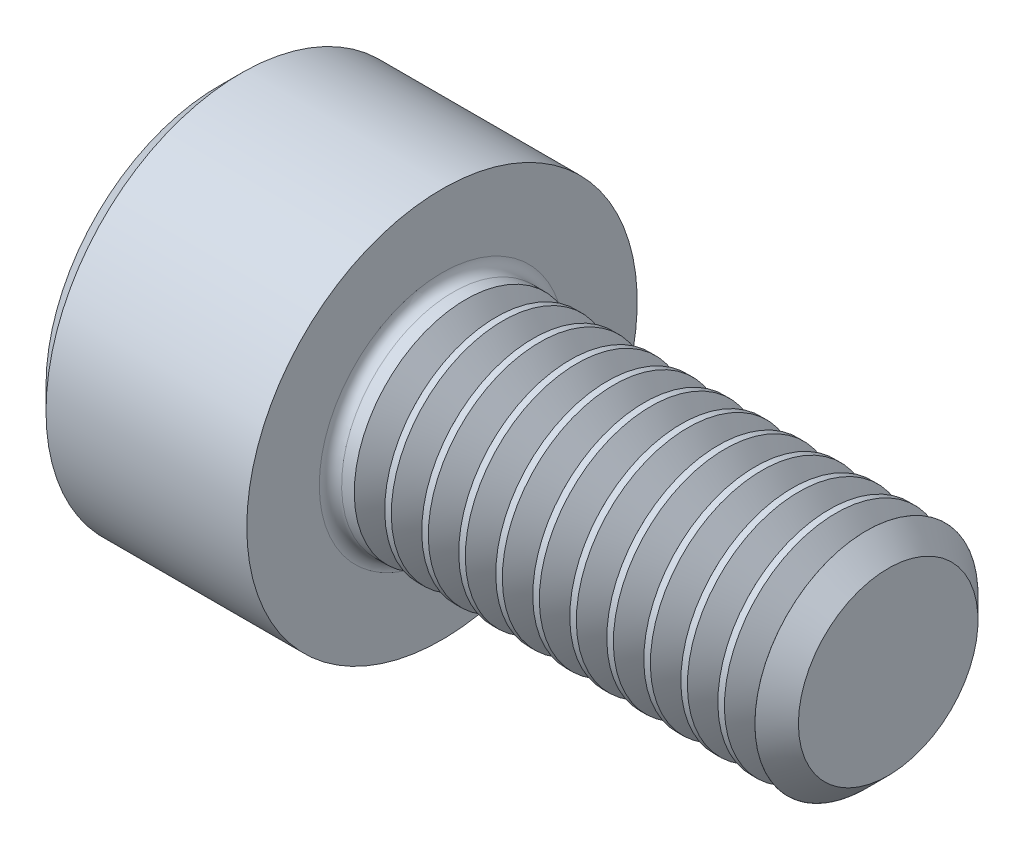
ISO-10303-21;
HEADER;
FILE_DESCRIPTION(('STEP AP214'),'2;1');
FILE_NAME('part.step','',(''),(''),'','','');
FILE_SCHEMA(('AUTOMOTIVE_DESIGN { 1 0 10303 214 1 1 1 1 }'));
ENDSEC;
DATA;
#1=APPLICATION_CONTEXT('core data for automotive mechanical design processes');
#2=APPLICATION_PROTOCOL_DEFINITION('international standard','automotive_design',2000,#1);
#3=PRODUCT_CONTEXT('',#1,'mechanical');
#4=PRODUCT('Part','Part','',(#3));
#5=PRODUCT_RELATED_PRODUCT_CATEGORY('part','',(#4));
#6=PRODUCT_DEFINITION_FORMATION('','',#4);
#7=PRODUCT_DEFINITION_CONTEXT('part definition',#1,'design');
#8=PRODUCT_DEFINITION('design','',#6,#7);
#9=PRODUCT_DEFINITION_SHAPE('','',#8);
#10=(LENGTH_UNIT() NAMED_UNIT(*) SI_UNIT(.MILLI.,.METRE.));
#11=(NAMED_UNIT(*) PLANE_ANGLE_UNIT() SI_UNIT($,.RADIAN.));
#12=(NAMED_UNIT(*) SI_UNIT($,.STERADIAN.) SOLID_ANGLE_UNIT());
#13=UNCERTAINTY_MEASURE_WITH_UNIT(LENGTH_MEASURE(1.E-05),#10,'distance_accuracy_value','');
#14=(GEOMETRIC_REPRESENTATION_CONTEXT(3) GLOBAL_UNCERTAINTY_ASSIGNED_CONTEXT((#13)) GLOBAL_UNIT_ASSIGNED_CONTEXT((#10,
#11,#12)) REPRESENTATION_CONTEXT('',''));
#15=CARTESIAN_POINT('',(0.,0.,0.));
#16=DIRECTION('',(0.,0.,1.));
#17=DIRECTION('',(1.,0.,0.));
#18=AXIS2_PLACEMENT_3D('',#15,#16,#17);
#19=CARTESIAN_POINT('',(0.,0.,0.));
#20=DIRECTION('',(-1.,0.,0.));
#21=DIRECTION('',(0.,0.,1.));
#22=AXIS2_PLACEMENT_3D('',#19,#20,#21);
#23=PLANE('',#22);
#24=DIRECTION('',(0.,-0.499999999999999,0.866025403784439));
#25=VECTOR('',#24,1.);
#26=CARTESIAN_POINT('',(0.,1.77304267668134,0.));
#27=LINE('',#26,#25);
#28=CARTESIAN_POINT('',(0.,1.77304267668134,0.));
#29=VERTEX_POINT('',#28);
#30=CARTESIAN_POINT('',(0.,0.886521338340669,1.5355));
#31=VERTEX_POINT('',#30);
#32=EDGE_CURVE('E426',#29,#31,#27,.T.);
#33=ORIENTED_EDGE('',*,*,#32,.T.);
#34=DIRECTION('',(0.,1.,0.));
#35=VECTOR('',#34,1.);
#36=CARTESIAN_POINT('',(0.,-0.886521338340672,1.5355));
#37=LINE('',#36,#35);
#38=CARTESIAN_POINT('',(0.,-0.886521338340672,1.5355));
#39=VERTEX_POINT('',#38);
#40=EDGE_CURVE('E130',#39,#31,#37,.T.);
#41=ORIENTED_EDGE('',*,*,#40,.F.);
#42=DIRECTION('',(0.,-0.500000000000001,-0.866025403784438));
#43=VECTOR('',#42,1.);
#44=CARTESIAN_POINT('',(0.,-0.886521338340672,1.5355));
#45=LINE('',#44,#43);
#46=CARTESIAN_POINT('',(0.,-1.77304267668134,0.));
#47=VERTEX_POINT('',#46);
#48=EDGE_CURVE('E445',#39,#47,#45,.T.);
#49=ORIENTED_EDGE('',*,*,#48,.T.);
#50=DIRECTION('',(0.,0.499999999999999,-0.866025403784439));
#51=VECTOR('',#50,1.);
#52=CARTESIAN_POINT('',(0.,-1.77304267668134,0.));
#53=LINE('',#52,#51);
#54=CARTESIAN_POINT('',(0.,-0.886521338340676,-1.5355));
#55=VERTEX_POINT('',#54);
#56=EDGE_CURVE('E448',#47,#55,#53,.T.);
#57=ORIENTED_EDGE('',*,*,#56,.T.);
#58=DIRECTION('',(0.,-1.,0.));
#59=VECTOR('',#58,1.);
#60=CARTESIAN_POINT('',(0.,0.886521338340665,-1.5355));
#61=LINE('',#60,#59);
#62=CARTESIAN_POINT('',(0.,0.886521338340665,-1.5355));
#63=VERTEX_POINT('',#62);
#64=EDGE_CURVE('E451',#63,#55,#61,.T.);
#65=ORIENTED_EDGE('',*,*,#64,.F.);
#66=DIRECTION('',(0.,-0.500000000000001,-0.866025403784438));
#67=VECTOR('',#66,1.);
#68=CARTESIAN_POINT('',(0.,1.77304267668134,0.));
#69=LINE('',#68,#67);
#70=EDGE_CURVE('E125',#29,#63,#69,.T.);
#71=ORIENTED_EDGE('',*,*,#70,.F.);
#72=EDGE_LOOP('',(#33,#41,#49,#57,#65,#71));
#73=FACE_BOUND('',#72,.T.);
#74=CARTESIAN_POINT('',(0.,0.,0.));
#75=DIRECTION('',(-1.,0.,0.));
#76=DIRECTION('',(0.,0.,1.));
#77=AXIS2_PLACEMENT_3D('',#74,#75,#76);
#78=CIRCLE('',#77,3.1);
#79=CARTESIAN_POINT('',(0.,0.,3.1));
#80=VERTEX_POINT('',#79);
#81=EDGE_CURVE('E154',#80,#80,#78,.T.);
#82=ORIENTED_EDGE('',*,*,#81,.T.);
#83=EDGE_LOOP('',(#82));
#84=FACE_BOUND('',#83,.T.);
#85=ADVANCED_FACE('F34',(#73,#84),#23,.T.);
#86=CARTESIAN_POINT('',(0.,0.,0.));
#87=DIRECTION('',(1.,0.,0.));
#88=DIRECTION('',(0.,0.,-1.));
#89=AXIS2_PLACEMENT_3D('',#86,#87,#88);
#90=CONICAL_SURFACE('',#89,3.1,0.785398163397451);
#91=CARTESIAN_POINT('',(0.399999999999998,0.,0.));
#92=DIRECTION('',(-1.,0.,0.));
#93=DIRECTION('',(0.,0.,1.));
#94=AXIS2_PLACEMENT_3D('',#91,#92,#93);
#95=CIRCLE('',#94,3.5);
#96=CARTESIAN_POINT('',(0.399999999999998,0.,3.5));
#97=VERTEX_POINT('',#96);
#98=EDGE_CURVE('E151',#97,#97,#95,.T.);
#99=ORIENTED_EDGE('',*,*,#98,.T.);
#100=EDGE_LOOP('',(#99));
#101=FACE_BOUND('',#100,.T.);
#102=ORIENTED_EDGE('',*,*,#81,.F.);
#103=EDGE_LOOP('',(#102));
#104=FACE_BOUND('',#103,.T.);
#105=ADVANCED_FACE('F176',(#101,#104),#90,.T.);
#106=CARTESIAN_POINT('',(-31.75,0.,0.));
#107=DIRECTION('',(-1.,0.,0.));
#108=DIRECTION('',(0.,0.,1.));
#109=AXIS2_PLACEMENT_3D('',#106,#107,#108);
#110=CYLINDRICAL_SURFACE('',#109,3.5);
#111=CARTESIAN_POINT('',(4.,0.,0.));
#112=DIRECTION('',(-1.,0.,0.));
#113=DIRECTION('',(0.,0.,1.));
#114=AXIS2_PLACEMENT_3D('',#111,#112,#113);
#115=CIRCLE('',#114,3.5);
#116=CARTESIAN_POINT('',(4.,0.,3.5));
#117=VERTEX_POINT('',#116);
#118=EDGE_CURVE('E148',#117,#117,#115,.T.);
#119=ORIENTED_EDGE('',*,*,#118,.T.);
#120=EDGE_LOOP('',(#119));
#121=FACE_BOUND('',#120,.T.);
#122=ORIENTED_EDGE('',*,*,#98,.F.);
#123=EDGE_LOOP('',(#122));
#124=FACE_BOUND('',#123,.T.);
#125=ADVANCED_FACE('F181',(#121,#124),#110,.T.);
#126=CARTESIAN_POINT('',(4.,3.5,0.));
#127=DIRECTION('',(1.,0.,0.));
#128=DIRECTION('',(0.,0.,-1.));
#129=AXIS2_PLACEMENT_3D('',#126,#127,#128);
#130=PLANE('',#129);
#131=CARTESIAN_POINT('',(4.,0.,0.));
#132=DIRECTION('',(1.,0.,0.));
#133=DIRECTION('',(0.,0.,-1.));
#134=AXIS2_PLACEMENT_3D('',#131,#132,#133);
#135=CIRCLE('',#134,2.19999999999981);
#136=CARTESIAN_POINT('',(4.,0.,-2.19999999999981));
#137=VERTEX_POINT('',#136);
#138=EDGE_CURVE('E42',#137,#137,#135,.F.);
#139=ORIENTED_EDGE('',*,*,#138,.T.);
#140=EDGE_LOOP('',(#139));
#141=FACE_BOUND('',#140,.T.);
#142=ORIENTED_EDGE('',*,*,#118,.F.);
#143=EDGE_LOOP('',(#142));
#144=FACE_BOUND('',#143,.T.);
#145=ADVANCED_FACE('F159',(#141,#144),#130,.T.);
#146=CARTESIAN_POINT('',(-31.75,0.,0.));
#147=DIRECTION('',(-1.,0.,0.));
#148=DIRECTION('',(0.,0.,1.));
#149=AXIS2_PLACEMENT_3D('',#146,#147,#148);
#150=CYLINDRICAL_SURFACE('',#149,1.99999999999981);
#151=CARTESIAN_POINT('',(4.42691906009821,0.,0.));
#152=DIRECTION('',(-1.,0.,0.));
#153=DIRECTION('',(0.,-1.,0.));
#154=AXIS2_PLACEMENT_3D('',#151,#152,#153);
#155=CIRCLE('',#154,2.);
#156=CARTESIAN_POINT('',(4.42691906009821,-2.,0.));
#157=VERTEX_POINT('',#156);
#158=EDGE_CURVE('E421',#157,#157,#155,.T.);
#159=ORIENTED_EDGE('',*,*,#158,.T.);
#160=EDGE_LOOP('',(#159));
#161=FACE_BOUND('',#160,.T.);
#162=CARTESIAN_POINT('',(4.2,0.,0.));
#163=DIRECTION('',(1.,0.,0.));
#164=DIRECTION('',(0.,0.,-1.));
#165=AXIS2_PLACEMENT_3D('',#162,#163,#164);
#166=CIRCLE('',#165,1.99999999999981);
#167=CARTESIAN_POINT('',(4.2,0.,-1.99999999999981));
#168=VERTEX_POINT('',#167);
#169=EDGE_CURVE('E11',#168,#168,#166,.T.);
#170=ORIENTED_EDGE('',*,*,#169,.T.);
#171=EDGE_LOOP('',(#170));
#172=FACE_BOUND('',#171,.T.);
#173=ADVANCED_FACE('F163',(#161,#172),#150,.T.);
#174=CARTESIAN_POINT('',(4.2,0.,0.));
#175=DIRECTION('',(1.,0.,0.));
#176=DIRECTION('',(0.,0.,-1.));
#177=AXIS2_PLACEMENT_3D('',#174,#175,#176);
#178=TOROIDAL_SURFACE('',#177,2.19999999999981,0.2);
#179=ORIENTED_EDGE('',*,*,#169,.F.);
#180=EDGE_LOOP('',(#179));
#181=FACE_BOUND('',#180,.T.);
#182=ORIENTED_EDGE('',*,*,#138,.F.);
#183=EDGE_LOOP('',(#182));
#184=FACE_BOUND('',#183,.T.);
#185=ADVANCED_FACE('F36',(#181,#184),#178,.F.);
#186=CARTESIAN_POINT('',(2.,1.77304267668134,0.));
#187=DIRECTION('',(0.,-0.866025403784439,-0.499999999999999));
#188=DIRECTION('',(0.,0.499999999999999,-0.866025403784439));
#189=AXIS2_PLACEMENT_3D('',#186,#187,#188);
#190=PLANE('',#189);
#191=ORIENTED_EDGE('',*,*,#32,.F.);
#192=DIRECTION('',(-1.,0.,0.));
#193=VECTOR('',#192,1.);
#194=CARTESIAN_POINT('',(2.,1.77304267668134,0.));
#195=LINE('',#194,#193);
#196=CARTESIAN_POINT('',(2.,1.77304267668134,0.));
#197=VERTEX_POINT('',#196);
#198=EDGE_CURVE('E442',#197,#29,#195,.T.);
#199=ORIENTED_EDGE('',*,*,#198,.F.);
#200=DIRECTION('',(0.,-0.499999999999999,0.866025403784439));
#201=VECTOR('',#200,1.);
#202=CARTESIAN_POINT('',(2.,1.77304267668134,0.));
#203=LINE('',#202,#201);
#204=CARTESIAN_POINT('',(2.,1.329782007511,0.767749999999996));
#205=VERTEX_POINT('',#204);
#206=EDGE_CURVE('E117',#197,#205,#203,.T.);
#207=ORIENTED_EDGE('',*,*,#206,.T.);
#208=CARTESIAN_POINT('',(2.,0.886521338340669,1.5355));
#209=VERTEX_POINT('',#208);
#210=EDGE_CURVE('E108',#205,#209,#203,.T.);
#211=ORIENTED_EDGE('',*,*,#210,.T.);
#212=DIRECTION('',(-1.,0.,0.));
#213=VECTOR('',#212,1.);
#214=CARTESIAN_POINT('',(2.,0.886521338340669,1.5355));
#215=LINE('',#214,#213);
#216=EDGE_CURVE('E122',#209,#31,#215,.T.);
#217=ORIENTED_EDGE('',*,*,#216,.T.);
#218=EDGE_LOOP('',(#191,#199,#207,#211,#217));
#219=FACE_BOUND('',#218,.T.);
#220=ADVANCED_FACE('F121',(#219),#190,.T.);
#221=CARTESIAN_POINT('',(2.,-0.886521338340672,1.5355));
#222=DIRECTION('',(0.,0.,1.));
#223=DIRECTION('',(0.,-1.,0.));
#224=AXIS2_PLACEMENT_3D('',#221,#222,#223);
#225=PLANE('',#224);
#226=ORIENTED_EDGE('',*,*,#40,.T.);
#227=ORIENTED_EDGE('',*,*,#216,.F.);
#228=DIRECTION('',(0.,1.,0.));
#229=VECTOR('',#228,1.);
#230=CARTESIAN_POINT('',(2.,-0.886521338340672,1.5355));
#231=LINE('',#230,#229);
#232=CARTESIAN_POINT('',(2.,0.,1.5355));
#233=VERTEX_POINT('',#232);
#234=EDGE_CURVE('E105',#233,#209,#231,.T.);
#235=ORIENTED_EDGE('',*,*,#234,.F.);
#236=CARTESIAN_POINT('',(2.,-0.886521338340672,1.5355));
#237=VERTEX_POINT('',#236);
#238=EDGE_CURVE('E116',#237,#233,#231,.T.);
#239=ORIENTED_EDGE('',*,*,#238,.F.);
#240=DIRECTION('',(-1.,0.,0.));
#241=VECTOR('',#240,1.);
#242=CARTESIAN_POINT('',(2.,-0.886521338340672,1.5355));
#243=LINE('',#242,#241);
#244=EDGE_CURVE('E132',#237,#39,#243,.T.);
#245=ORIENTED_EDGE('',*,*,#244,.T.);
#246=EDGE_LOOP('',(#226,#227,#235,#239,#245));
#247=FACE_BOUND('',#246,.T.);
#248=ADVANCED_FACE('F127',(#247),#225,.F.);
#249=CARTESIAN_POINT('',(2.,-0.886521338340672,1.5355));
#250=DIRECTION('',(0.,0.866025403784438,-0.500000000000001));
#251=DIRECTION('',(0.,0.500000000000001,0.866025403784438));
#252=AXIS2_PLACEMENT_3D('',#249,#250,#251);
#253=PLANE('',#252);
#254=ORIENTED_EDGE('',*,*,#48,.F.);
#255=ORIENTED_EDGE('',*,*,#244,.F.);
#256=DIRECTION('',(0.,-0.500000000000001,-0.866025403784438));
#257=VECTOR('',#256,1.);
#258=CARTESIAN_POINT('',(2.,-0.886521338340672,1.5355));
#259=LINE('',#258,#257);
#260=CARTESIAN_POINT('',(2.,-1.32978200751101,0.767750000000002));
#261=VERTEX_POINT('',#260);
#262=EDGE_CURVE('E429',#237,#261,#259,.T.);
#263=ORIENTED_EDGE('',*,*,#262,.T.);
#264=CARTESIAN_POINT('',(2.,-1.77304267668134,0.));
#265=VERTEX_POINT('',#264);
#266=EDGE_CURVE('E428',#261,#265,#259,.T.);
#267=ORIENTED_EDGE('',*,*,#266,.T.);
#268=DIRECTION('',(-1.,0.,0.));
#269=VECTOR('',#268,1.);
#270=CARTESIAN_POINT('',(2.,-1.77304267668134,0.));
#271=LINE('',#270,#269);
#272=EDGE_CURVE('E137',#265,#47,#271,.T.);
#273=ORIENTED_EDGE('',*,*,#272,.T.);
#274=EDGE_LOOP('',(#254,#255,#263,#267,#273));
#275=FACE_BOUND('',#274,.T.);
#276=ADVANCED_FACE('F207',(#275),#253,.T.);
#277=CARTESIAN_POINT('',(2.,-1.77304267668134,0.));
#278=DIRECTION('',(0.,0.866025403784439,0.499999999999999));
#279=DIRECTION('',(0.,-0.499999999999999,0.866025403784439));
#280=AXIS2_PLACEMENT_3D('',#277,#278,#279);
#281=PLANE('',#280);
#282=ORIENTED_EDGE('',*,*,#56,.F.);
#283=ORIENTED_EDGE('',*,*,#272,.F.);
#284=DIRECTION('',(0.,0.499999999999999,-0.866025403784439));
#285=VECTOR('',#284,1.);
#286=CARTESIAN_POINT('',(2.,-1.77304267668134,0.));
#287=LINE('',#286,#285);
#288=CARTESIAN_POINT('',(2.,-1.32978200751101,-0.76775));
#289=VERTEX_POINT('',#288);
#290=EDGE_CURVE('E433',#265,#289,#287,.T.);
#291=ORIENTED_EDGE('',*,*,#290,.T.);
#292=CARTESIAN_POINT('',(2.,-0.886521338340676,-1.5355));
#293=VERTEX_POINT('',#292);
#294=EDGE_CURVE('E432',#289,#293,#287,.T.);
#295=ORIENTED_EDGE('',*,*,#294,.T.);
#296=DIRECTION('',(-1.,0.,0.));
#297=VECTOR('',#296,1.);
#298=CARTESIAN_POINT('',(2.,-0.886521338340676,-1.5355));
#299=LINE('',#298,#297);
#300=EDGE_CURVE('E460',#293,#55,#299,.T.);
#301=ORIENTED_EDGE('',*,*,#300,.T.);
#302=EDGE_LOOP('',(#282,#283,#291,#295,#301));
#303=FACE_BOUND('',#302,.T.);
#304=ADVANCED_FACE('F210',(#303),#281,.T.);
#305=CARTESIAN_POINT('',(2.,0.886521338340665,-1.5355));
#306=DIRECTION('',(0.,0.,-1.));
#307=DIRECTION('',(0.,1.,0.));
#308=AXIS2_PLACEMENT_3D('',#305,#306,#307);
#309=PLANE('',#308);
#310=ORIENTED_EDGE('',*,*,#64,.T.);
#311=ORIENTED_EDGE('',*,*,#300,.F.);
#312=DIRECTION('',(0.,-1.,0.));
#313=VECTOR('',#312,1.);
#314=CARTESIAN_POINT('',(2.,0.886521338340665,-1.5355));
#315=LINE('',#314,#313);
#316=CARTESIAN_POINT('',(2.,0.,-1.5355));
#317=VERTEX_POINT('',#316);
#318=EDGE_CURVE('E436',#317,#293,#315,.T.);
#319=ORIENTED_EDGE('',*,*,#318,.F.);
#320=CARTESIAN_POINT('',(2.,0.886521338340665,-1.5355));
#321=VERTEX_POINT('',#320);
#322=EDGE_CURVE('E49',#321,#317,#315,.T.);
#323=ORIENTED_EDGE('',*,*,#322,.F.);
#324=DIRECTION('',(-1.,0.,0.));
#325=VECTOR('',#324,1.);
#326=CARTESIAN_POINT('',(2.,0.886521338340665,-1.5355));
#327=LINE('',#326,#325);
#328=EDGE_CURVE('E457',#321,#63,#327,.T.);
#329=ORIENTED_EDGE('',*,*,#328,.T.);
#330=EDGE_LOOP('',(#310,#311,#319,#323,#329));
#331=FACE_BOUND('',#330,.T.);
#332=ADVANCED_FACE('F214',(#331),#309,.F.);
#333=CARTESIAN_POINT('',(2.,1.77304267668134,0.));
#334=DIRECTION('',(0.,0.866025403784438,-0.500000000000001));
#335=DIRECTION('',(0.,0.500000000000001,0.866025403784438));
#336=AXIS2_PLACEMENT_3D('',#333,#334,#335);
#337=PLANE('',#336);
#338=ORIENTED_EDGE('',*,*,#70,.T.);
#339=ORIENTED_EDGE('',*,*,#328,.F.);
#340=DIRECTION('',(0.,-0.500000000000001,-0.866025403784438));
#341=VECTOR('',#340,1.);
#342=CARTESIAN_POINT('',(2.,1.77304267668134,0.));
#343=LINE('',#342,#341);
#344=CARTESIAN_POINT('',(2.,1.329782007511,-0.767750000000001));
#345=VERTEX_POINT('',#344);
#346=EDGE_CURVE('E438',#345,#321,#343,.T.);
#347=ORIENTED_EDGE('',*,*,#346,.F.);
#348=EDGE_CURVE('E439',#197,#345,#343,.T.);
#349=ORIENTED_EDGE('',*,*,#348,.F.);
#350=ORIENTED_EDGE('',*,*,#198,.T.);
#351=EDGE_LOOP('',(#338,#339,#347,#349,#350));
#352=FACE_BOUND('',#351,.T.);
#353=ADVANCED_FACE('F218',(#352),#337,.F.);
#354=CARTESIAN_POINT('',(2.,2.65956401502201,-1.53550000000001));
#355=DIRECTION('',(1.,0.,0.));
#356=DIRECTION('',(0.,0.,-1.));
#357=AXIS2_PLACEMENT_3D('',#354,#355,#356);
#358=PLANE('',#357);
#359=ORIENTED_EDGE('',*,*,#318,.T.);
#360=ORIENTED_EDGE('',*,*,#294,.F.);
#361=CARTESIAN_POINT('',(2.,0.,0.));
#362=DIRECTION('',(-1.,0.,0.));
#363=DIRECTION('',(0.,0.,1.));
#364=AXIS2_PLACEMENT_3D('',#361,#362,#363);
#365=CIRCLE('',#364,1.5355);
#366=EDGE_CURVE('E477',#317,#289,#365,.T.);
#367=ORIENTED_EDGE('',*,*,#366,.F.);
#368=EDGE_LOOP('',(#359,#360,#367));
#369=FACE_BOUND('',#368,.T.);
#370=ADVANCED_FACE('F222',(#369),#358,.F.);
#371=ORIENTED_EDGE('',*,*,#290,.F.);
#372=ORIENTED_EDGE('',*,*,#266,.F.);
#373=EDGE_CURVE('E135',#289,#261,#365,.T.);
#374=ORIENTED_EDGE('',*,*,#373,.F.);
#375=EDGE_LOOP('',(#371,#372,#374));
#376=FACE_BOUND('',#375,.T.);
#377=ADVANCED_FACE('F226',(#376),#358,.F.);
#378=ORIENTED_EDGE('',*,*,#262,.F.);
#379=ORIENTED_EDGE('',*,*,#238,.T.);
#380=EDGE_CURVE('E131',#261,#233,#365,.T.);
#381=ORIENTED_EDGE('',*,*,#380,.F.);
#382=EDGE_LOOP('',(#378,#379,#381));
#383=FACE_BOUND('',#382,.T.);
#384=ADVANCED_FACE('F486',(#383),#358,.F.);
#385=ORIENTED_EDGE('',*,*,#234,.T.);
#386=ORIENTED_EDGE('',*,*,#210,.F.);
#387=EDGE_CURVE('E111',#233,#205,#365,.T.);
#388=ORIENTED_EDGE('',*,*,#387,.F.);
#389=EDGE_LOOP('',(#385,#386,#388));
#390=FACE_BOUND('',#389,.T.);
#391=ADVANCED_FACE('F107',(#390),#358,.F.);
#392=ORIENTED_EDGE('',*,*,#206,.F.);
#393=ORIENTED_EDGE('',*,*,#348,.T.);
#394=EDGE_CURVE('E142',#205,#345,#365,.T.);
#395=ORIENTED_EDGE('',*,*,#394,.F.);
#396=EDGE_LOOP('',(#392,#393,#395));
#397=FACE_BOUND('',#396,.T.);
#398=ADVANCED_FACE('F472',(#397),#358,.F.);
#399=ORIENTED_EDGE('',*,*,#346,.T.);
#400=ORIENTED_EDGE('',*,*,#322,.T.);
#401=EDGE_CURVE('E476',#345,#317,#365,.T.);
#402=ORIENTED_EDGE('',*,*,#401,.F.);
#403=EDGE_LOOP('',(#399,#400,#402));
#404=FACE_BOUND('',#403,.T.);
#405=ADVANCED_FACE('F203',(#404),#358,.F.);
#406=CARTESIAN_POINT('',(2.,0.,0.));
#407=DIRECTION('',(-1.,0.,0.));
#408=DIRECTION('',(0.,0.,1.));
#409=AXIS2_PLACEMENT_3D('',#406,#407,#408);
#410=CONICAL_SURFACE('',#409,1.5355,1.04719755119659);
#411=CARTESIAN_POINT('',(2.88652133834068,0.,0.));
#412=VERTEX_POINT('',#411);
#413=VERTEX_LOOP('',#412);
#414=FACE_BOUND('',#413,.T.);
#415=ORIENTED_EDGE('',*,*,#387,.T.);
#416=ORIENTED_EDGE('',*,*,#394,.T.);
#417=ORIENTED_EDGE('',*,*,#401,.T.);
#418=ORIENTED_EDGE('',*,*,#366,.T.);
#419=ORIENTED_EDGE('',*,*,#373,.T.);
#420=ORIENTED_EDGE('',*,*,#380,.T.);
#421=EDGE_LOOP('',(#415,#416,#417,#418,#419,#420));
#422=FACE_BOUND('',#421,.T.);
#423=ADVANCED_FACE('F200',(#414,#422),#410,.F.);
#424=CARTESIAN_POINT('',(4.97308093990178,0.,0.));
#425=DIRECTION('',(1.,0.,0.));
#426=DIRECTION('',(0.,1.,0.));
#427=AXIS2_PLACEMENT_3D('',#424,#425,#426);
#428=CONICAL_SURFACE('',#427,2.,0.959931088596884);
#429=CARTESIAN_POINT('',(4.7,0.,0.));
#430=DIRECTION('',(-1.,0.,0.));
#431=DIRECTION('',(0.,-1.,0.));
#432=AXIS2_PLACEMENT_3D('',#429,#430,#431);
#433=CIRCLE('',#432,1.61);
#434=CARTESIAN_POINT('',(4.7,-1.61,0.));
#435=VERTEX_POINT('',#434);
#436=EDGE_CURVE('E418',#435,#435,#433,.T.);
#437=ORIENTED_EDGE('',*,*,#436,.F.);
#438=EDGE_LOOP('',(#437));
#439=FACE_BOUND('',#438,.T.);
#440=CARTESIAN_POINT('',(4.97308093990178,0.,0.));
#441=DIRECTION('',(-1.,0.,0.));
#442=DIRECTION('',(0.,-1.,0.));
#443=AXIS2_PLACEMENT_3D('',#440,#441,#442);
#444=CIRCLE('',#443,2.);
#445=CARTESIAN_POINT('',(4.97308093990178,-2.,0.));
#446=VERTEX_POINT('',#445);
#447=EDGE_CURVE('E424',#446,#446,#444,.T.);
#448=ORIENTED_EDGE('',*,*,#447,.T.);
#449=EDGE_LOOP('',(#448));
#450=FACE_BOUND('',#449,.T.);
#451=ADVANCED_FACE('F202',(#439,#450),#428,.T.);
#452=CARTESIAN_POINT('',(4.7,0.,0.));
#453=DIRECTION('',(-1.,0.,0.));
#454=DIRECTION('',(0.,-1.,0.));
#455=AXIS2_PLACEMENT_3D('',#452,#453,#454);
#456=CONICAL_SURFACE('',#455,1.61,0.959931088596875);
#457=ORIENTED_EDGE('',*,*,#158,.F.);
#458=EDGE_LOOP('',(#457));
#459=FACE_BOUND('',#458,.T.);
#460=ORIENTED_EDGE('',*,*,#436,.T.);
#461=EDGE_LOOP('',(#460));
#462=FACE_BOUND('',#461,.T.);
#463=ADVANCED_FACE('F230',(#459,#462),#456,.T.);
#464=CARTESIAN_POINT('',(5.09055542373457,0.,0.));
#465=DIRECTION('',(-1.,0.,0.));
#466=DIRECTION('',(0.,-1.,0.));
#467=AXIS2_PLACEMENT_3D('',#464,#465,#466);
#468=CIRCLE('',#467,2.);
#469=CARTESIAN_POINT('',(5.09055542373457,-2.,0.));
#470=VERTEX_POINT('',#469);
#471=EDGE_CURVE('E412',#470,#470,#468,.T.);
#472=ORIENTED_EDGE('',*,*,#471,.T.);
#473=EDGE_LOOP('',(#472));
#474=FACE_BOUND('',#473,.T.);
#475=ORIENTED_EDGE('',*,*,#447,.F.);
#476=EDGE_LOOP('',(#475));
#477=FACE_BOUND('',#476,.T.);
#478=ADVANCED_FACE('F173',(#474,#477),#150,.T.);
#479=CARTESIAN_POINT('',(5.63671730353815,0.,0.));
#480=DIRECTION('',(1.,0.,0.));
#481=DIRECTION('',(0.,1.,0.));
#482=AXIS2_PLACEMENT_3D('',#479,#480,#481);
#483=CONICAL_SURFACE('',#482,2.,0.959931088596884);
#484=CARTESIAN_POINT('',(5.36363636363636,0.,0.));
#485=DIRECTION('',(-1.,0.,0.));
#486=DIRECTION('',(0.,-1.,0.));
#487=AXIS2_PLACEMENT_3D('',#484,#485,#486);
#488=CIRCLE('',#487,1.61);
#489=CARTESIAN_POINT('',(5.36363636363636,-1.61,0.));
#490=VERTEX_POINT('',#489);
#491=EDGE_CURVE('E409',#490,#490,#488,.T.);
#492=ORIENTED_EDGE('',*,*,#491,.F.);
#493=EDGE_LOOP('',(#492));
#494=FACE_BOUND('',#493,.T.);
#495=CARTESIAN_POINT('',(5.63671730353815,0.,0.));
#496=DIRECTION('',(-1.,0.,0.));
#497=DIRECTION('',(0.,-1.,0.));
#498=AXIS2_PLACEMENT_3D('',#495,#496,#497);
#499=CIRCLE('',#498,2.);
#500=CARTESIAN_POINT('',(5.63671730353815,-2.,0.));
#501=VERTEX_POINT('',#500);
#502=EDGE_CURVE('E415',#501,#501,#499,.T.);
#503=ORIENTED_EDGE('',*,*,#502,.T.);
#504=EDGE_LOOP('',(#503));
#505=FACE_BOUND('',#504,.T.);
#506=ADVANCED_FACE('F235',(#494,#505),#483,.T.);
#507=CARTESIAN_POINT('',(5.36363636363636,0.,0.));
#508=DIRECTION('',(-1.,0.,0.));
#509=DIRECTION('',(0.,-1.,0.));
#510=AXIS2_PLACEMENT_3D('',#507,#508,#509);
#511=CONICAL_SURFACE('',#510,1.61,0.959931088596875);
#512=ORIENTED_EDGE('',*,*,#471,.F.);
#513=EDGE_LOOP('',(#512));
#514=FACE_BOUND('',#513,.T.);
#515=ORIENTED_EDGE('',*,*,#491,.T.);
#516=EDGE_LOOP('',(#515));
#517=FACE_BOUND('',#516,.T.);
#518=ADVANCED_FACE('F238',(#514,#517),#511,.T.);
#519=CARTESIAN_POINT('',(5.75419178737094,0.,0.));
#520=DIRECTION('',(-1.,0.,0.));
#521=DIRECTION('',(0.,-1.,0.));
#522=AXIS2_PLACEMENT_3D('',#519,#520,#521);
#523=CIRCLE('',#522,2.);
#524=CARTESIAN_POINT('',(5.75419178737094,-2.,0.));
#525=VERTEX_POINT('',#524);
#526=EDGE_CURVE('E403',#525,#525,#523,.T.);
#527=ORIENTED_EDGE('',*,*,#526,.T.);
#528=EDGE_LOOP('',(#527));
#529=FACE_BOUND('',#528,.T.);
#530=ORIENTED_EDGE('',*,*,#502,.F.);
#531=EDGE_LOOP('',(#530));
#532=FACE_BOUND('',#531,.T.);
#533=ADVANCED_FACE('F242',(#529,#532),#150,.T.);
#534=CARTESIAN_POINT('',(6.30035366717451,0.,0.));
#535=DIRECTION('',(1.,0.,0.));
#536=DIRECTION('',(0.,1.,0.));
#537=AXIS2_PLACEMENT_3D('',#534,#535,#536);
#538=CONICAL_SURFACE('',#537,2.,0.959931088596884);
#539=CARTESIAN_POINT('',(6.02727272727273,0.,0.));
#540=DIRECTION('',(-1.,0.,0.));
#541=DIRECTION('',(0.,-1.,0.));
#542=AXIS2_PLACEMENT_3D('',#539,#540,#541);
#543=CIRCLE('',#542,1.61);
#544=CARTESIAN_POINT('',(6.02727272727273,-1.61,0.));
#545=VERTEX_POINT('',#544);
#546=EDGE_CURVE('E400',#545,#545,#543,.T.);
#547=ORIENTED_EDGE('',*,*,#546,.F.);
#548=EDGE_LOOP('',(#547));
#549=FACE_BOUND('',#548,.T.);
#550=CARTESIAN_POINT('',(6.30035366717451,0.,0.));
#551=DIRECTION('',(-1.,0.,0.));
#552=DIRECTION('',(0.,-1.,0.));
#553=AXIS2_PLACEMENT_3D('',#550,#551,#552);
#554=CIRCLE('',#553,2.);
#555=CARTESIAN_POINT('',(6.30035366717451,-2.,0.));
#556=VERTEX_POINT('',#555);
#557=EDGE_CURVE('E406',#556,#556,#554,.T.);
#558=ORIENTED_EDGE('',*,*,#557,.T.);
#559=EDGE_LOOP('',(#558));
#560=FACE_BOUND('',#559,.T.);
#561=ADVANCED_FACE('F244',(#549,#560),#538,.T.);
#562=CARTESIAN_POINT('',(6.02727272727273,0.,0.));
#563=DIRECTION('',(-1.,0.,0.));
#564=DIRECTION('',(0.,-1.,0.));
#565=AXIS2_PLACEMENT_3D('',#562,#563,#564);
#566=CONICAL_SURFACE('',#565,1.61,0.959931088596875);
#567=ORIENTED_EDGE('',*,*,#526,.F.);
#568=EDGE_LOOP('',(#567));
#569=FACE_BOUND('',#568,.T.);
#570=ORIENTED_EDGE('',*,*,#546,.T.);
#571=EDGE_LOOP('',(#570));
#572=FACE_BOUND('',#571,.T.);
#573=ADVANCED_FACE('F247',(#569,#572),#566,.T.);
#574=CARTESIAN_POINT('',(6.4178281510073,0.,0.));
#575=DIRECTION('',(-1.,0.,0.));
#576=DIRECTION('',(0.,-1.,0.));
#577=AXIS2_PLACEMENT_3D('',#574,#575,#576);
#578=CIRCLE('',#577,2.);
#579=CARTESIAN_POINT('',(6.4178281510073,-2.,0.));
#580=VERTEX_POINT('',#579);
#581=EDGE_CURVE('E394',#580,#580,#578,.T.);
#582=ORIENTED_EDGE('',*,*,#581,.T.);
#583=EDGE_LOOP('',(#582));
#584=FACE_BOUND('',#583,.T.);
#585=ORIENTED_EDGE('',*,*,#557,.F.);
#586=EDGE_LOOP('',(#585));
#587=FACE_BOUND('',#586,.T.);
#588=ADVANCED_FACE('F251',(#584,#587),#150,.T.);
#589=CARTESIAN_POINT('',(6.96399003081087,0.,0.));
#590=DIRECTION('',(1.,0.,0.));
#591=DIRECTION('',(0.,1.,0.));
#592=AXIS2_PLACEMENT_3D('',#589,#590,#591);
#593=CONICAL_SURFACE('',#592,2.,0.959931088596884);
#594=CARTESIAN_POINT('',(6.69090909090909,0.,0.));
#595=DIRECTION('',(-1.,0.,0.));
#596=DIRECTION('',(0.,-1.,0.));
#597=AXIS2_PLACEMENT_3D('',#594,#595,#596);
#598=CIRCLE('',#597,1.61);
#599=CARTESIAN_POINT('',(6.69090909090909,-1.61,0.));
#600=VERTEX_POINT('',#599);
#601=EDGE_CURVE('E391',#600,#600,#598,.T.);
#602=ORIENTED_EDGE('',*,*,#601,.F.);
#603=EDGE_LOOP('',(#602));
#604=FACE_BOUND('',#603,.T.);
#605=CARTESIAN_POINT('',(6.96399003081087,0.,0.));
#606=DIRECTION('',(-1.,0.,0.));
#607=DIRECTION('',(0.,-1.,0.));
#608=AXIS2_PLACEMENT_3D('',#605,#606,#607);
#609=CIRCLE('',#608,2.);
#610=CARTESIAN_POINT('',(6.96399003081087,-2.,0.));
#611=VERTEX_POINT('',#610);
#612=EDGE_CURVE('E397',#611,#611,#609,.T.);
#613=ORIENTED_EDGE('',*,*,#612,.T.);
#614=EDGE_LOOP('',(#613));
#615=FACE_BOUND('',#614,.T.);
#616=ADVANCED_FACE('F253',(#604,#615),#593,.T.);
#617=CARTESIAN_POINT('',(6.69090909090909,0.,0.));
#618=DIRECTION('',(-1.,0.,0.));
#619=DIRECTION('',(0.,-1.,0.));
#620=AXIS2_PLACEMENT_3D('',#617,#618,#619);
#621=CONICAL_SURFACE('',#620,1.61,0.959931088596875);
#622=ORIENTED_EDGE('',*,*,#581,.F.);
#623=EDGE_LOOP('',(#622));
#624=FACE_BOUND('',#623,.T.);
#625=ORIENTED_EDGE('',*,*,#601,.T.);
#626=EDGE_LOOP('',(#625));
#627=FACE_BOUND('',#626,.T.);
#628=ADVANCED_FACE('F256',(#624,#627),#621,.T.);
#629=CARTESIAN_POINT('',(7.08146451464366,0.,0.));
#630=DIRECTION('',(-1.,0.,0.));
#631=DIRECTION('',(0.,-1.,0.));
#632=AXIS2_PLACEMENT_3D('',#629,#630,#631);
#633=CIRCLE('',#632,2.);
#634=CARTESIAN_POINT('',(7.08146451464366,-2.,0.));
#635=VERTEX_POINT('',#634);
#636=EDGE_CURVE('E385',#635,#635,#633,.T.);
#637=ORIENTED_EDGE('',*,*,#636,.T.);
#638=EDGE_LOOP('',(#637));
#639=FACE_BOUND('',#638,.T.);
#640=ORIENTED_EDGE('',*,*,#612,.F.);
#641=EDGE_LOOP('',(#640));
#642=FACE_BOUND('',#641,.T.);
#643=ADVANCED_FACE('F260',(#639,#642),#150,.T.);
#644=CARTESIAN_POINT('',(7.62762639444724,0.,0.));
#645=DIRECTION('',(1.,0.,0.));
#646=DIRECTION('',(0.,1.,0.));
#647=AXIS2_PLACEMENT_3D('',#644,#645,#646);
#648=CONICAL_SURFACE('',#647,2.,0.959931088596884);
#649=CARTESIAN_POINT('',(7.35454545454545,0.,0.));
#650=DIRECTION('',(-1.,0.,0.));
#651=DIRECTION('',(0.,-1.,0.));
#652=AXIS2_PLACEMENT_3D('',#649,#650,#651);
#653=CIRCLE('',#652,1.61);
#654=CARTESIAN_POINT('',(7.35454545454545,-1.61,0.));
#655=VERTEX_POINT('',#654);
#656=EDGE_CURVE('E382',#655,#655,#653,.T.);
#657=ORIENTED_EDGE('',*,*,#656,.F.);
#658=EDGE_LOOP('',(#657));
#659=FACE_BOUND('',#658,.T.);
#660=CARTESIAN_POINT('',(7.62762639444724,0.,0.));
#661=DIRECTION('',(-1.,0.,0.));
#662=DIRECTION('',(0.,-1.,0.));
#663=AXIS2_PLACEMENT_3D('',#660,#661,#662);
#664=CIRCLE('',#663,2.);
#665=CARTESIAN_POINT('',(7.62762639444724,-2.,0.));
#666=VERTEX_POINT('',#665);
#667=EDGE_CURVE('E388',#666,#666,#664,.T.);
#668=ORIENTED_EDGE('',*,*,#667,.T.);
#669=EDGE_LOOP('',(#668));
#670=FACE_BOUND('',#669,.T.);
#671=ADVANCED_FACE('F262',(#659,#670),#648,.T.);
#672=CARTESIAN_POINT('',(7.35454545454545,0.,0.));
#673=DIRECTION('',(-1.,0.,0.));
#674=DIRECTION('',(0.,-1.,0.));
#675=AXIS2_PLACEMENT_3D('',#672,#673,#674);
#676=CONICAL_SURFACE('',#675,1.61,0.959931088596875);
#677=ORIENTED_EDGE('',*,*,#636,.F.);
#678=EDGE_LOOP('',(#677));
#679=FACE_BOUND('',#678,.T.);
#680=ORIENTED_EDGE('',*,*,#656,.T.);
#681=EDGE_LOOP('',(#680));
#682=FACE_BOUND('',#681,.T.);
#683=ADVANCED_FACE('F265',(#679,#682),#676,.T.);
#684=CARTESIAN_POINT('',(7.74510087828003,0.,0.));
#685=DIRECTION('',(-1.,0.,0.));
#686=DIRECTION('',(0.,-1.,0.));
#687=AXIS2_PLACEMENT_3D('',#684,#685,#686);
#688=CIRCLE('',#687,2.);
#689=CARTESIAN_POINT('',(7.74510087828003,-2.,0.));
#690=VERTEX_POINT('',#689);
#691=EDGE_CURVE('E376',#690,#690,#688,.T.);
#692=ORIENTED_EDGE('',*,*,#691,.T.);
#693=EDGE_LOOP('',(#692));
#694=FACE_BOUND('',#693,.T.);
#695=ORIENTED_EDGE('',*,*,#667,.F.);
#696=EDGE_LOOP('',(#695));
#697=FACE_BOUND('',#696,.T.);
#698=ADVANCED_FACE('F269',(#694,#697),#150,.T.);
#699=CARTESIAN_POINT('',(8.2912627580836,0.,0.));
#700=DIRECTION('',(1.,0.,0.));
#701=DIRECTION('',(0.,1.,0.));
#702=AXIS2_PLACEMENT_3D('',#699,#700,#701);
#703=CONICAL_SURFACE('',#702,2.,0.959931088596884);
#704=CARTESIAN_POINT('',(8.01818181818182,0.,0.));
#705=DIRECTION('',(-1.,0.,0.));
#706=DIRECTION('',(0.,-1.,0.));
#707=AXIS2_PLACEMENT_3D('',#704,#705,#706);
#708=CIRCLE('',#707,1.61);
#709=CARTESIAN_POINT('',(8.01818181818182,-1.61,0.));
#710=VERTEX_POINT('',#709);
#711=EDGE_CURVE('E373',#710,#710,#708,.T.);
#712=ORIENTED_EDGE('',*,*,#711,.F.);
#713=EDGE_LOOP('',(#712));
#714=FACE_BOUND('',#713,.T.);
#715=CARTESIAN_POINT('',(8.2912627580836,0.,0.));
#716=DIRECTION('',(-1.,0.,0.));
#717=DIRECTION('',(0.,-1.,0.));
#718=AXIS2_PLACEMENT_3D('',#715,#716,#717);
#719=CIRCLE('',#718,2.);
#720=CARTESIAN_POINT('',(8.2912627580836,-2.,0.));
#721=VERTEX_POINT('',#720);
#722=EDGE_CURVE('E379',#721,#721,#719,.T.);
#723=ORIENTED_EDGE('',*,*,#722,.T.);
#724=EDGE_LOOP('',(#723));
#725=FACE_BOUND('',#724,.T.);
#726=ADVANCED_FACE('F271',(#714,#725),#703,.T.);
#727=CARTESIAN_POINT('',(8.01818181818182,0.,0.));
#728=DIRECTION('',(-1.,0.,0.));
#729=DIRECTION('',(0.,-1.,0.));
#730=AXIS2_PLACEMENT_3D('',#727,#728,#729);
#731=CONICAL_SURFACE('',#730,1.61,0.959931088596875);
#732=ORIENTED_EDGE('',*,*,#691,.F.);
#733=EDGE_LOOP('',(#732));
#734=FACE_BOUND('',#733,.T.);
#735=ORIENTED_EDGE('',*,*,#711,.T.);
#736=EDGE_LOOP('',(#735));
#737=FACE_BOUND('',#736,.T.);
#738=ADVANCED_FACE('F274',(#734,#737),#731,.T.);
#739=CARTESIAN_POINT('',(8.40873724191639,0.,0.));
#740=DIRECTION('',(-1.,0.,0.));
#741=DIRECTION('',(0.,-1.,0.));
#742=AXIS2_PLACEMENT_3D('',#739,#740,#741);
#743=CIRCLE('',#742,2.);
#744=CARTESIAN_POINT('',(8.40873724191639,-2.,0.));
#745=VERTEX_POINT('',#744);
#746=EDGE_CURVE('E367',#745,#745,#743,.T.);
#747=ORIENTED_EDGE('',*,*,#746,.T.);
#748=EDGE_LOOP('',(#747));
#749=FACE_BOUND('',#748,.T.);
#750=ORIENTED_EDGE('',*,*,#722,.F.);
#751=EDGE_LOOP('',(#750));
#752=FACE_BOUND('',#751,.T.);
#753=ADVANCED_FACE('F278',(#749,#752),#150,.T.);
#754=CARTESIAN_POINT('',(8.95489912171997,0.,0.));
#755=DIRECTION('',(1.,0.,0.));
#756=DIRECTION('',(0.,1.,0.));
#757=AXIS2_PLACEMENT_3D('',#754,#755,#756);
#758=CONICAL_SURFACE('',#757,2.,0.959931088596884);
#759=CARTESIAN_POINT('',(8.68181818181818,0.,0.));
#760=DIRECTION('',(-1.,0.,0.));
#761=DIRECTION('',(0.,-1.,0.));
#762=AXIS2_PLACEMENT_3D('',#759,#760,#761);
#763=CIRCLE('',#762,1.61);
#764=CARTESIAN_POINT('',(8.68181818181818,-1.61,0.));
#765=VERTEX_POINT('',#764);
#766=EDGE_CURVE('E364',#765,#765,#763,.T.);
#767=ORIENTED_EDGE('',*,*,#766,.F.);
#768=EDGE_LOOP('',(#767));
#769=FACE_BOUND('',#768,.T.);
#770=CARTESIAN_POINT('',(8.95489912171997,0.,0.));
#771=DIRECTION('',(-1.,0.,0.));
#772=DIRECTION('',(0.,-1.,0.));
#773=AXIS2_PLACEMENT_3D('',#770,#771,#772);
#774=CIRCLE('',#773,2.);
#775=CARTESIAN_POINT('',(8.95489912171997,-2.,0.));
#776=VERTEX_POINT('',#775);
#777=EDGE_CURVE('E370',#776,#776,#774,.T.);
#778=ORIENTED_EDGE('',*,*,#777,.T.);
#779=EDGE_LOOP('',(#778));
#780=FACE_BOUND('',#779,.T.);
#781=ADVANCED_FACE('F280',(#769,#780),#758,.T.);
#782=CARTESIAN_POINT('',(8.68181818181818,0.,0.));
#783=DIRECTION('',(-1.,0.,0.));
#784=DIRECTION('',(0.,-1.,0.));
#785=AXIS2_PLACEMENT_3D('',#782,#783,#784);
#786=CONICAL_SURFACE('',#785,1.61,0.959931088596875);
#787=ORIENTED_EDGE('',*,*,#746,.F.);
#788=EDGE_LOOP('',(#787));
#789=FACE_BOUND('',#788,.T.);
#790=ORIENTED_EDGE('',*,*,#766,.T.);
#791=EDGE_LOOP('',(#790));
#792=FACE_BOUND('',#791,.T.);
#793=ADVANCED_FACE('F283',(#789,#792),#786,.T.);
#794=CARTESIAN_POINT('',(9.07237360555275,0.,0.));
#795=DIRECTION('',(-1.,0.,0.));
#796=DIRECTION('',(0.,-1.,0.));
#797=AXIS2_PLACEMENT_3D('',#794,#795,#796);
#798=CIRCLE('',#797,2.);
#799=CARTESIAN_POINT('',(9.07237360555275,-2.,0.));
#800=VERTEX_POINT('',#799);
#801=EDGE_CURVE('E358',#800,#800,#798,.T.);
#802=ORIENTED_EDGE('',*,*,#801,.T.);
#803=EDGE_LOOP('',(#802));
#804=FACE_BOUND('',#803,.T.);
#805=ORIENTED_EDGE('',*,*,#777,.F.);
#806=EDGE_LOOP('',(#805));
#807=FACE_BOUND('',#806,.T.);
#808=ADVANCED_FACE('F287',(#804,#807),#150,.T.);
#809=CARTESIAN_POINT('',(9.61853548535633,0.,0.));
#810=DIRECTION('',(1.,0.,0.));
#811=DIRECTION('',(0.,1.,0.));
#812=AXIS2_PLACEMENT_3D('',#809,#810,#811);
#813=CONICAL_SURFACE('',#812,2.,0.959931088596884);
#814=CARTESIAN_POINT('',(9.34545454545454,0.,0.));
#815=DIRECTION('',(-1.,0.,0.));
#816=DIRECTION('',(0.,-1.,0.));
#817=AXIS2_PLACEMENT_3D('',#814,#815,#816);
#818=CIRCLE('',#817,1.61);
#819=CARTESIAN_POINT('',(9.34545454545454,-1.61,0.));
#820=VERTEX_POINT('',#819);
#821=EDGE_CURVE('E355',#820,#820,#818,.T.);
#822=ORIENTED_EDGE('',*,*,#821,.F.);
#823=EDGE_LOOP('',(#822));
#824=FACE_BOUND('',#823,.T.);
#825=CARTESIAN_POINT('',(9.61853548535633,0.,0.));
#826=DIRECTION('',(-1.,0.,0.));
#827=DIRECTION('',(0.,-1.,0.));
#828=AXIS2_PLACEMENT_3D('',#825,#826,#827);
#829=CIRCLE('',#828,2.);
#830=CARTESIAN_POINT('',(9.61853548535633,-2.,0.));
#831=VERTEX_POINT('',#830);
#832=EDGE_CURVE('E361',#831,#831,#829,.T.);
#833=ORIENTED_EDGE('',*,*,#832,.T.);
#834=EDGE_LOOP('',(#833));
#835=FACE_BOUND('',#834,.T.);
#836=ADVANCED_FACE('F289',(#824,#835),#813,.T.);
#837=CARTESIAN_POINT('',(9.34545454545454,0.,0.));
#838=DIRECTION('',(-1.,0.,0.));
#839=DIRECTION('',(0.,-1.,0.));
#840=AXIS2_PLACEMENT_3D('',#837,#838,#839);
#841=CONICAL_SURFACE('',#840,1.61,0.959931088596875);
#842=ORIENTED_EDGE('',*,*,#801,.F.);
#843=EDGE_LOOP('',(#842));
#844=FACE_BOUND('',#843,.T.);
#845=ORIENTED_EDGE('',*,*,#821,.T.);
#846=EDGE_LOOP('',(#845));
#847=FACE_BOUND('',#846,.T.);
#848=ADVANCED_FACE('F292',(#844,#847),#841,.T.);
#849=CARTESIAN_POINT('',(9.73600996918912,0.,0.));
#850=DIRECTION('',(-1.,0.,0.));
#851=DIRECTION('',(0.,-1.,0.));
#852=AXIS2_PLACEMENT_3D('',#849,#850,#851);
#853=CIRCLE('',#852,2.);
#854=CARTESIAN_POINT('',(9.73600996918912,-2.,0.));
#855=VERTEX_POINT('',#854);
#856=EDGE_CURVE('E349',#855,#855,#853,.T.);
#857=ORIENTED_EDGE('',*,*,#856,.T.);
#858=EDGE_LOOP('',(#857));
#859=FACE_BOUND('',#858,.T.);
#860=ORIENTED_EDGE('',*,*,#832,.F.);
#861=EDGE_LOOP('',(#860));
#862=FACE_BOUND('',#861,.T.);
#863=ADVANCED_FACE('F296',(#859,#862),#150,.T.);
#864=CARTESIAN_POINT('',(10.2821718489927,0.,0.));
#865=DIRECTION('',(1.,0.,0.));
#866=DIRECTION('',(0.,1.,0.));
#867=AXIS2_PLACEMENT_3D('',#864,#865,#866);
#868=CONICAL_SURFACE('',#867,2.,0.959931088596884);
#869=CARTESIAN_POINT('',(10.0090909090909,0.,0.));
#870=DIRECTION('',(-1.,0.,0.));
#871=DIRECTION('',(0.,-1.,0.));
#872=AXIS2_PLACEMENT_3D('',#869,#870,#871);
#873=CIRCLE('',#872,1.61);
#874=CARTESIAN_POINT('',(10.0090909090909,-1.61,0.));
#875=VERTEX_POINT('',#874);
#876=EDGE_CURVE('E346',#875,#875,#873,.T.);
#877=ORIENTED_EDGE('',*,*,#876,.F.);
#878=EDGE_LOOP('',(#877));
#879=FACE_BOUND('',#878,.T.);
#880=CARTESIAN_POINT('',(10.2821718489927,0.,0.));
#881=DIRECTION('',(-1.,0.,0.));
#882=DIRECTION('',(0.,-1.,0.));
#883=AXIS2_PLACEMENT_3D('',#880,#881,#882);
#884=CIRCLE('',#883,2.);
#885=CARTESIAN_POINT('',(10.2821718489927,-2.,0.));
#886=VERTEX_POINT('',#885);
#887=EDGE_CURVE('E352',#886,#886,#884,.T.);
#888=ORIENTED_EDGE('',*,*,#887,.T.);
#889=EDGE_LOOP('',(#888));
#890=FACE_BOUND('',#889,.T.);
#891=ADVANCED_FACE('F298',(#879,#890),#868,.T.);
#892=CARTESIAN_POINT('',(10.0090909090909,0.,0.));
#893=DIRECTION('',(-1.,0.,0.));
#894=DIRECTION('',(0.,-1.,0.));
#895=AXIS2_PLACEMENT_3D('',#892,#893,#894);
#896=CONICAL_SURFACE('',#895,1.61,0.959931088596875);
#897=ORIENTED_EDGE('',*,*,#856,.F.);
#898=EDGE_LOOP('',(#897));
#899=FACE_BOUND('',#898,.T.);
#900=ORIENTED_EDGE('',*,*,#876,.T.);
#901=EDGE_LOOP('',(#900));
#902=FACE_BOUND('',#901,.T.);
#903=ADVANCED_FACE('F301',(#899,#902),#896,.T.);
#904=CARTESIAN_POINT('',(10.3996463328255,0.,0.));
#905=DIRECTION('',(-1.,0.,0.));
#906=DIRECTION('',(0.,-1.,0.));
#907=AXIS2_PLACEMENT_3D('',#904,#905,#906);
#908=CIRCLE('',#907,2.);
#909=CARTESIAN_POINT('',(10.3996463328255,-2.,0.));
#910=VERTEX_POINT('',#909);
#911=EDGE_CURVE('E340',#910,#910,#908,.T.);
#912=ORIENTED_EDGE('',*,*,#911,.T.);
#913=EDGE_LOOP('',(#912));
#914=FACE_BOUND('',#913,.T.);
#915=ORIENTED_EDGE('',*,*,#887,.F.);
#916=EDGE_LOOP('',(#915));
#917=FACE_BOUND('',#916,.T.);
#918=ADVANCED_FACE('F305',(#914,#917),#150,.T.);
#919=CARTESIAN_POINT('',(10.9458082126291,0.,0.));
#920=DIRECTION('',(1.,0.,0.));
#921=DIRECTION('',(0.,1.,0.));
#922=AXIS2_PLACEMENT_3D('',#919,#920,#921);
#923=CONICAL_SURFACE('',#922,2.,0.959931088596884);
#924=CARTESIAN_POINT('',(10.6727272727273,0.,0.));
#925=DIRECTION('',(-1.,0.,0.));
#926=DIRECTION('',(0.,-1.,0.));
#927=AXIS2_PLACEMENT_3D('',#924,#925,#926);
#928=CIRCLE('',#927,1.61);
#929=CARTESIAN_POINT('',(10.6727272727273,-1.61,0.));
#930=VERTEX_POINT('',#929);
#931=EDGE_CURVE('E337',#930,#930,#928,.T.);
#932=ORIENTED_EDGE('',*,*,#931,.F.);
#933=EDGE_LOOP('',(#932));
#934=FACE_BOUND('',#933,.T.);
#935=CARTESIAN_POINT('',(10.9458082126291,0.,0.));
#936=DIRECTION('',(-1.,0.,0.));
#937=DIRECTION('',(0.,-1.,0.));
#938=AXIS2_PLACEMENT_3D('',#935,#936,#937);
#939=CIRCLE('',#938,2.);
#940=CARTESIAN_POINT('',(10.9458082126291,-2.,0.));
#941=VERTEX_POINT('',#940);
#942=EDGE_CURVE('E343',#941,#941,#939,.T.);
#943=ORIENTED_EDGE('',*,*,#942,.T.);
#944=EDGE_LOOP('',(#943));
#945=FACE_BOUND('',#944,.T.);
#946=ADVANCED_FACE('F307',(#934,#945),#923,.T.);
#947=CARTESIAN_POINT('',(10.6727272727273,0.,0.));
#948=DIRECTION('',(-1.,0.,0.));
#949=DIRECTION('',(0.,-1.,0.));
#950=AXIS2_PLACEMENT_3D('',#947,#948,#949);
#951=CONICAL_SURFACE('',#950,1.61,0.959931088596875);
#952=ORIENTED_EDGE('',*,*,#911,.F.);
#953=EDGE_LOOP('',(#952));
#954=FACE_BOUND('',#953,.T.);
#955=ORIENTED_EDGE('',*,*,#931,.T.);
#956=EDGE_LOOP('',(#955));
#957=FACE_BOUND('',#956,.T.);
#958=ADVANCED_FACE('F310',(#954,#957),#951,.T.);
#959=CARTESIAN_POINT('',(11.0632826964618,0.,0.));
#960=DIRECTION('',(-1.,0.,0.));
#961=DIRECTION('',(0.,-1.,0.));
#962=AXIS2_PLACEMENT_3D('',#959,#960,#961);
#963=CIRCLE('',#962,2.);
#964=CARTESIAN_POINT('',(11.0632826964618,-2.,0.));
#965=VERTEX_POINT('',#964);
#966=EDGE_CURVE('E327',#965,#965,#963,.T.);
#967=ORIENTED_EDGE('',*,*,#966,.T.);
#968=EDGE_LOOP('',(#967));
#969=FACE_BOUND('',#968,.T.);
#970=ORIENTED_EDGE('',*,*,#942,.F.);
#971=EDGE_LOOP('',(#970));
#972=FACE_BOUND('',#971,.T.);
#973=ADVANCED_FACE('F314',(#969,#972),#150,.T.);
#974=CARTESIAN_POINT('',(11.6094445762654,0.,0.));
#975=DIRECTION('',(1.,0.,0.));
#976=DIRECTION('',(0.,1.,0.));
#977=AXIS2_PLACEMENT_3D('',#974,#975,#976);
#978=CONICAL_SURFACE('',#977,2.,0.959931088596884);
#979=CARTESIAN_POINT('',(11.3363636363636,0.,0.));
#980=DIRECTION('',(-1.,0.,0.));
#981=DIRECTION('',(0.,-1.,0.));
#982=AXIS2_PLACEMENT_3D('',#979,#980,#981);
#983=CIRCLE('',#982,1.61);
#984=CARTESIAN_POINT('',(11.3363636363636,-1.61,0.));
#985=VERTEX_POINT('',#984);
#986=EDGE_CURVE('E330',#985,#985,#983,.T.);
#987=ORIENTED_EDGE('',*,*,#986,.F.);
#988=EDGE_LOOP('',(#987));
#989=FACE_BOUND('',#988,.T.);
#990=CARTESIAN_POINT('',(11.6094445762654,0.,0.));
#991=DIRECTION('',(-1.,0.,0.));
#992=DIRECTION('',(0.,-1.,0.));
#993=AXIS2_PLACEMENT_3D('',#990,#991,#992);
#994=CIRCLE('',#993,2.);
#995=CARTESIAN_POINT('',(11.6094445762654,-2.,0.));
#996=VERTEX_POINT('',#995);
#997=EDGE_CURVE('E332',#996,#996,#994,.T.);
#998=ORIENTED_EDGE('',*,*,#997,.T.);
#999=EDGE_LOOP('',(#998));
#1000=FACE_BOUND('',#999,.T.);
#1001=ADVANCED_FACE('F316',(#989,#1000),#978,.T.);
#1002=CARTESIAN_POINT('',(11.3363636363636,0.,0.));
#1003=DIRECTION('',(-1.,0.,0.));
#1004=DIRECTION('',(0.,-1.,0.));
#1005=AXIS2_PLACEMENT_3D('',#1002,#1003,#1004);
#1006=CONICAL_SURFACE('',#1005,1.61,0.959931088596875);
#1007=ORIENTED_EDGE('',*,*,#966,.F.);
#1008=EDGE_LOOP('',(#1007));
#1009=FACE_BOUND('',#1008,.T.);
#1010=ORIENTED_EDGE('',*,*,#986,.T.);
#1011=EDGE_LOOP('',(#1010));
#1012=FACE_BOUND('',#1011,.T.);
#1013=ADVANCED_FACE('F198',(#1009,#1012),#1006,.T.);
#1014=CARTESIAN_POINT('',(12.,1.61,0.));
#1015=DIRECTION('',(1.,0.,0.));
#1016=DIRECTION('',(0.,0.,-1.));
#1017=AXIS2_PLACEMENT_3D('',#1014,#1015,#1016);
#1018=PLANE('',#1017);
#1019=CARTESIAN_POINT('',(12.,0.,0.));
#1020=DIRECTION('',(-1.,0.,0.));
#1021=DIRECTION('',(0.,0.,1.));
#1022=AXIS2_PLACEMENT_3D('',#1019,#1020,#1021);
#1023=CIRCLE('',#1022,1.61);
#1024=CARTESIAN_POINT('',(12.,0.,1.61));
#1025=VERTEX_POINT('',#1024);
#1026=EDGE_CURVE('E141',#1025,#1025,#1023,.T.);
#1027=ORIENTED_EDGE('',*,*,#1026,.F.);
#1028=EDGE_LOOP('',(#1027));
#1029=FACE_BOUND('',#1028,.T.);
#1030=ADVANCED_FACE('F194',(#1029),#1018,.T.);
#1031=CARTESIAN_POINT('',(12.,0.,0.));
#1032=DIRECTION('',(-1.,0.,0.));
#1033=DIRECTION('',(0.,0.,1.));
#1034=AXIS2_PLACEMENT_3D('',#1031,#1032,#1033);
#1035=CONICAL_SURFACE('',#1034,1.61,0.785398163396508);
#1036=CARTESIAN_POINT('',(11.6099999999996,0.,0.));
#1037=DIRECTION('',(-1.,0.,0.));
#1038=DIRECTION('',(0.,0.,1.));
#1039=AXIS2_PLACEMENT_3D('',#1036,#1037,#1038);
#1040=CIRCLE('',#1039,1.99999999999962);
#1041=CARTESIAN_POINT('',(11.6099999999996,0.,1.99999999999962));
#1042=VERTEX_POINT('',#1041);
#1043=EDGE_CURVE('E145',#1042,#1042,#1040,.T.);
#1044=ORIENTED_EDGE('',*,*,#1043,.F.);
#1045=EDGE_LOOP('',(#1044));
#1046=FACE_BOUND('',#1045,.T.);
#1047=ORIENTED_EDGE('',*,*,#1026,.T.);
#1048=EDGE_LOOP('',(#1047));
#1049=FACE_BOUND('',#1048,.T.);
#1050=ADVANCED_FACE('F191',(#1046,#1049),#1035,.T.);
#1051=ORIENTED_EDGE('',*,*,#997,.F.);
#1052=EDGE_LOOP('',(#1051));
#1053=FACE_BOUND('',#1052,.T.);
#1054=ORIENTED_EDGE('',*,*,#1043,.T.);
#1055=EDGE_LOOP('',(#1054));
#1056=FACE_BOUND('',#1055,.T.);
#1057=ADVANCED_FACE('F172',(#1053,#1056),#150,.T.);
#1058=CLOSED_SHELL('',(#85,#105,#125,#145,#173,#185,#220,#248,#276,#304,#332,#353,#370,#377,
#384,#391,#398,#405,#423,#451,#463,#478,#506,#518,#533,#561,#573,#588,#616,#628,#643,#671,#683,
#698,#726,#738,#753,#781,#793,#808,#836,#848,#863,#891,#903,#918,#946,#958,#973,#1001,#1013,
#1030,#1050,#1057));
#1059=MANIFOLD_SOLID_BREP('B2',#1058);
#1060=ADVANCED_BREP_SHAPE_REPRESENTATION('',(#18,#1059),#14);
#1061=SHAPE_DEFINITION_REPRESENTATION(#9,#1060);
ENDSEC;
END-ISO-10303-21;
